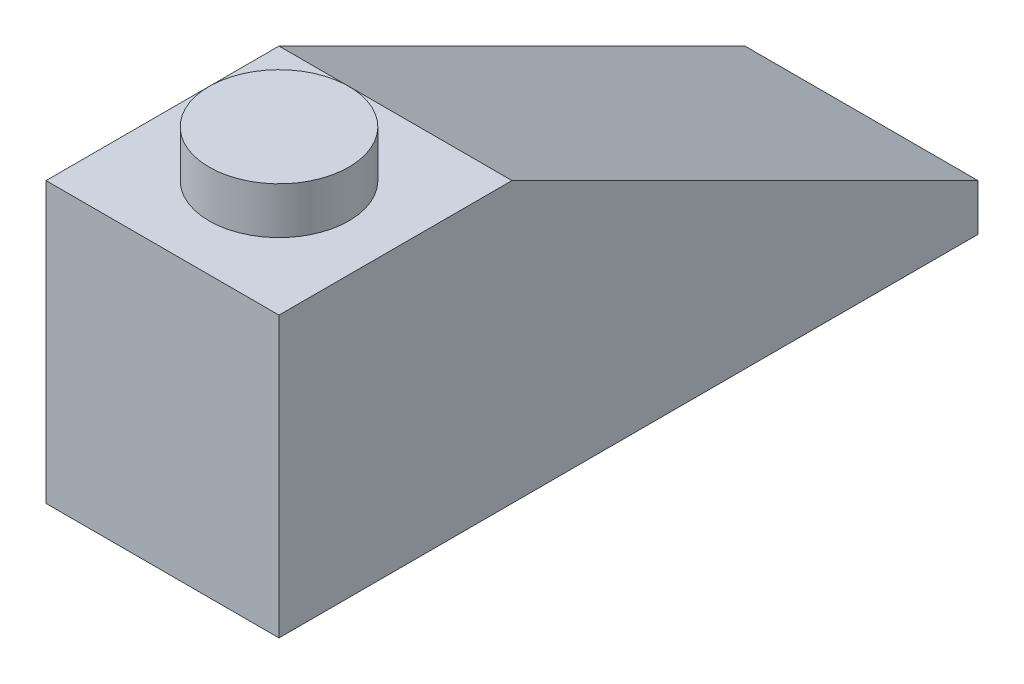
ISO-10303-21;
HEADER;
FILE_DESCRIPTION(('STEP AP214'),'2;1');
FILE_NAME('part.step','',(''),(''),'','','');
FILE_SCHEMA(('AUTOMOTIVE_DESIGN { 1 0 10303 214 1 1 1 1 }'));
ENDSEC;
DATA;
#1=APPLICATION_CONTEXT('core data for automotive mechanical design processes');
#2=APPLICATION_PROTOCOL_DEFINITION('international standard','automotive_design',2000,#1);
#3=PRODUCT_CONTEXT('',#1,'mechanical');
#4=PRODUCT('Part','Part','',(#3));
#5=PRODUCT_RELATED_PRODUCT_CATEGORY('part','',(#4));
#6=PRODUCT_DEFINITION_FORMATION('','',#4);
#7=PRODUCT_DEFINITION_CONTEXT('part definition',#1,'design');
#8=PRODUCT_DEFINITION('design','',#6,#7);
#9=PRODUCT_DEFINITION_SHAPE('','',#8);
#10=(LENGTH_UNIT() NAMED_UNIT(*) SI_UNIT(.MILLI.,.METRE.));
#11=(NAMED_UNIT(*) PLANE_ANGLE_UNIT() SI_UNIT($,.RADIAN.));
#12=(NAMED_UNIT(*) SI_UNIT($,.STERADIAN.) SOLID_ANGLE_UNIT());
#13=UNCERTAINTY_MEASURE_WITH_UNIT(LENGTH_MEASURE(1.E-05),#10,'distance_accuracy_value','');
#14=(GEOMETRIC_REPRESENTATION_CONTEXT(3) GLOBAL_UNCERTAINTY_ASSIGNED_CONTEXT((#13)) GLOBAL_UNIT_ASSIGNED_CONTEXT((#10,
#11,#12)) REPRESENTATION_CONTEXT('',''));
#15=CARTESIAN_POINT('',(0.,0.,0.));
#16=DIRECTION('',(0.,0.,1.));
#17=DIRECTION('',(1.,0.,0.));
#18=AXIS2_PLACEMENT_3D('',#15,#16,#17);
#19=CARTESIAN_POINT('',(8.,0.,0.));
#20=DIRECTION('',(0.,1.,0.));
#21=DIRECTION('',(0.,0.,1.));
#22=AXIS2_PLACEMENT_3D('',#19,#20,#21);
#23=PLANE('',#22);
#24=DIRECTION('',(0.,0.,-1.));
#25=VECTOR('',#24,1.);
#26=CARTESIAN_POINT('',(0.,0.,0.));
#27=LINE('',#26,#25);
#28=CARTESIAN_POINT('',(0.,0.,0.));
#29=VERTEX_POINT('',#28);
#30=CARTESIAN_POINT('',(0.,0.,-24.));
#31=VERTEX_POINT('',#30);
#32=EDGE_CURVE('E138',#29,#31,#27,.T.);
#33=ORIENTED_EDGE('',*,*,#32,.T.);
#34=DIRECTION('',(-1.,0.,0.));
#35=VECTOR('',#34,1.);
#36=CARTESIAN_POINT('',(8.,0.,-24.));
#37=LINE('',#36,#35);
#38=CARTESIAN_POINT('',(8.,0.,-24.));
#39=VERTEX_POINT('',#38);
#40=EDGE_CURVE('E123',#39,#31,#37,.T.);
#41=ORIENTED_EDGE('',*,*,#40,.F.);
#42=DIRECTION('',(0.,0.,-1.));
#43=VECTOR('',#42,1.);
#44=CARTESIAN_POINT('',(8.,0.,0.));
#45=LINE('',#44,#43);
#46=CARTESIAN_POINT('',(8.,0.,0.));
#47=VERTEX_POINT('',#46);
#48=EDGE_CURVE('E98',#47,#39,#45,.T.);
#49=ORIENTED_EDGE('',*,*,#48,.F.);
#50=DIRECTION('',(-1.,0.,0.));
#51=VECTOR('',#50,1.);
#52=CARTESIAN_POINT('',(8.,0.,0.));
#53=LINE('',#52,#51);
#54=EDGE_CURVE('E43',#47,#29,#53,.T.);
#55=ORIENTED_EDGE('',*,*,#54,.T.);
#56=EDGE_LOOP('',(#33,#41,#49,#55));
#57=FACE_BOUND('',#56,.T.);
#58=DIRECTION('',(0.,0.,-1.));
#59=VECTOR('',#58,1.);
#60=CARTESIAN_POINT('',(1.6,0.,0.));
#61=LINE('',#60,#59);
#62=CARTESIAN_POINT('',(1.6,0.,-1.6));
#63=VERTEX_POINT('',#62);
#64=CARTESIAN_POINT('',(1.6,0.,-22.4));
#65=VERTEX_POINT('',#64);
#66=EDGE_CURVE('E182',#63,#65,#61,.T.);
#67=ORIENTED_EDGE('',*,*,#66,.F.);
#68=DIRECTION('',(-1.,0.,0.));
#69=VECTOR('',#68,1.);
#70=CARTESIAN_POINT('',(8.,0.,-1.6));
#71=LINE('',#70,#69);
#72=CARTESIAN_POINT('',(6.4,0.,-1.6));
#73=VERTEX_POINT('',#72);
#74=EDGE_CURVE('E180',#73,#63,#71,.T.);
#75=ORIENTED_EDGE('',*,*,#74,.F.);
#76=DIRECTION('',(0.,0.,-1.));
#77=VECTOR('',#76,1.);
#78=CARTESIAN_POINT('',(6.4,0.,0.));
#79=LINE('',#78,#77);
#80=CARTESIAN_POINT('',(6.4,0.,-22.4));
#81=VERTEX_POINT('',#80);
#82=EDGE_CURVE('E171',#73,#81,#79,.T.);
#83=ORIENTED_EDGE('',*,*,#82,.T.);
#84=DIRECTION('',(-1.,0.,0.));
#85=VECTOR('',#84,1.);
#86=CARTESIAN_POINT('',(8.,0.,-22.4));
#87=LINE('',#86,#85);
#88=EDGE_CURVE('E176',#81,#65,#87,.T.);
#89=ORIENTED_EDGE('',*,*,#88,.T.);
#90=EDGE_LOOP('',(#67,#75,#83,#89));
#91=FACE_BOUND('',#90,.T.);
#92=ADVANCED_FACE('F39',(#57,#91),#23,.F.);
#93=CARTESIAN_POINT('',(8.,9.6,0.));
#94=DIRECTION('',(0.,0.,-1.));
#95=DIRECTION('',(-1.,0.,0.));
#96=AXIS2_PLACEMENT_3D('',#93,#94,#95);
#97=PLANE('',#96);
#98=DIRECTION('',(0.,-1.,0.));
#99=VECTOR('',#98,1.);
#100=CARTESIAN_POINT('',(0.,9.6,0.));
#101=LINE('',#100,#99);
#102=CARTESIAN_POINT('',(0.,9.6,0.));
#103=VERTEX_POINT('',#102);
#104=EDGE_CURVE('E134',#103,#29,#101,.T.);
#105=ORIENTED_EDGE('',*,*,#104,.T.);
#106=ORIENTED_EDGE('',*,*,#54,.F.);
#107=DIRECTION('',(0.,-1.,0.));
#108=VECTOR('',#107,1.);
#109=CARTESIAN_POINT('',(8.,9.6,0.));
#110=LINE('',#109,#108);
#111=CARTESIAN_POINT('',(8.,9.6,0.));
#112=VERTEX_POINT('',#111);
#113=EDGE_CURVE('E149',#112,#47,#110,.T.);
#114=ORIENTED_EDGE('',*,*,#113,.F.);
#115=DIRECTION('',(-1.,0.,0.));
#116=VECTOR('',#115,1.);
#117=CARTESIAN_POINT('',(8.,9.6,0.));
#118=LINE('',#117,#116);
#119=EDGE_CURVE('E130',#112,#103,#118,.T.);
#120=ORIENTED_EDGE('',*,*,#119,.T.);
#121=EDGE_LOOP('',(#105,#106,#114,#120));
#122=FACE_BOUND('',#121,.T.);
#123=ADVANCED_FACE('F41',(#122),#97,.F.);
#124=CARTESIAN_POINT('',(8.,0.,-24.));
#125=DIRECTION('',(0.,0.,1.));
#126=DIRECTION('',(1.,0.,0.));
#127=AXIS2_PLACEMENT_3D('',#124,#125,#126);
#128=PLANE('',#127);
#129=DIRECTION('',(0.,1.,0.));
#130=VECTOR('',#129,1.);
#131=CARTESIAN_POINT('',(0.,0.,-24.));
#132=LINE('',#131,#130);
#133=CARTESIAN_POINT('',(0.,1.6,-24.));
#134=VERTEX_POINT('',#133);
#135=EDGE_CURVE('E119',#31,#134,#132,.T.);
#136=ORIENTED_EDGE('',*,*,#135,.T.);
#137=DIRECTION('',(-1.,0.,0.));
#138=VECTOR('',#137,1.);
#139=CARTESIAN_POINT('',(8.,1.6,-24.));
#140=LINE('',#139,#138);
#141=CARTESIAN_POINT('',(8.,1.6,-24.));
#142=VERTEX_POINT('',#141);
#143=EDGE_CURVE('E116',#142,#134,#140,.T.);
#144=ORIENTED_EDGE('',*,*,#143,.F.);
#145=DIRECTION('',(0.,1.,0.));
#146=VECTOR('',#145,1.);
#147=CARTESIAN_POINT('',(8.,0.,-24.));
#148=LINE('',#147,#146);
#149=EDGE_CURVE('E105',#39,#142,#148,.T.);
#150=ORIENTED_EDGE('',*,*,#149,.F.);
#151=ORIENTED_EDGE('',*,*,#40,.T.);
#152=EDGE_LOOP('',(#136,#144,#150,#151));
#153=FACE_BOUND('',#152,.T.);
#154=ADVANCED_FACE('F117',(#153),#128,.F.);
#155=CARTESIAN_POINT('',(8.,1.6,-24.));
#156=DIRECTION('',(0.,-0.894427190999916,0.447213595499958));
#157=DIRECTION('',(0.,-0.447213595499958,-0.894427190999916));
#158=AXIS2_PLACEMENT_3D('',#155,#156,#157);
#159=PLANE('',#158);
#160=DIRECTION('',(0.,0.447213595499958,0.894427190999916));
#161=VECTOR('',#160,1.);
#162=CARTESIAN_POINT('',(0.,1.6,-24.));
#163=LINE('',#162,#161);
#164=CARTESIAN_POINT('',(0.,9.6,-8.));
#165=VERTEX_POINT('',#164);
#166=EDGE_CURVE('E144',#134,#165,#163,.T.);
#167=ORIENTED_EDGE('',*,*,#166,.T.);
#168=DIRECTION('',(-1.,0.,0.));
#169=VECTOR('',#168,1.);
#170=CARTESIAN_POINT('',(8.,9.6,-8.));
#171=LINE('',#170,#169);
#172=CARTESIAN_POINT('',(8.,9.6,-8.));
#173=VERTEX_POINT('',#172);
#174=EDGE_CURVE('E124',#173,#165,#171,.T.);
#175=ORIENTED_EDGE('',*,*,#174,.F.);
#176=DIRECTION('',(0.,0.447213595499958,0.894427190999916));
#177=VECTOR('',#176,1.);
#178=CARTESIAN_POINT('',(8.,1.6,-24.));
#179=LINE('',#178,#177);
#180=EDGE_CURVE('E109',#142,#173,#179,.T.);
#181=ORIENTED_EDGE('',*,*,#180,.F.);
#182=ORIENTED_EDGE('',*,*,#143,.T.);
#183=EDGE_LOOP('',(#167,#175,#181,#182));
#184=FACE_BOUND('',#183,.T.);
#185=ADVANCED_FACE('F126',(#184),#159,.F.);
#186=CARTESIAN_POINT('',(8.,9.6,-8.));
#187=DIRECTION('',(0.,-1.,0.));
#188=DIRECTION('',(0.,0.,-1.));
#189=AXIS2_PLACEMENT_3D('',#186,#187,#188);
#190=PLANE('',#189);
#191=CARTESIAN_POINT('',(4.,9.6,-4.));
#192=DIRECTION('',(0.,1.,0.));
#193=DIRECTION('',(0.,0.,1.));
#194=AXIS2_PLACEMENT_3D('',#191,#192,#193);
#195=CIRCLE('',#194,2.4);
#196=CARTESIAN_POINT('',(4.,9.6,-1.6));
#197=VERTEX_POINT('',#196);
#198=EDGE_CURVE('E11',#197,#197,#195,.T.);
#199=ORIENTED_EDGE('',*,*,#198,.F.);
#200=EDGE_LOOP('',(#199));
#201=FACE_BOUND('',#200,.T.);
#202=DIRECTION('',(0.,0.,1.));
#203=VECTOR('',#202,1.);
#204=CARTESIAN_POINT('',(0.,9.6,-8.));
#205=LINE('',#204,#203);
#206=EDGE_CURVE('E89',#165,#103,#205,.T.);
#207=ORIENTED_EDGE('',*,*,#206,.T.);
#208=ORIENTED_EDGE('',*,*,#119,.F.);
#209=DIRECTION('',(0.,0.,1.));
#210=VECTOR('',#209,1.);
#211=CARTESIAN_POINT('',(8.,9.6,-8.));
#212=LINE('',#211,#210);
#213=EDGE_CURVE('E65',#173,#112,#212,.T.);
#214=ORIENTED_EDGE('',*,*,#213,.F.);
#215=ORIENTED_EDGE('',*,*,#174,.T.);
#216=EDGE_LOOP('',(#207,#208,#214,#215));
#217=FACE_BOUND('',#216,.T.);
#218=ADVANCED_FACE('F162',(#201,#217),#190,.F.);
#219=CARTESIAN_POINT('',(8.,0.,0.));
#220=DIRECTION('',(1.,0.,0.));
#221=DIRECTION('',(0.,0.,-1.));
#222=AXIS2_PLACEMENT_3D('',#219,#220,#221);
#223=PLANE('',#222);
#224=ORIENTED_EDGE('',*,*,#113,.T.);
#225=ORIENTED_EDGE('',*,*,#48,.T.);
#226=ORIENTED_EDGE('',*,*,#149,.T.);
#227=ORIENTED_EDGE('',*,*,#180,.T.);
#228=ORIENTED_EDGE('',*,*,#213,.T.);
#229=EDGE_LOOP('',(#224,#225,#226,#227,#228));
#230=FACE_BOUND('',#229,.T.);
#231=ADVANCED_FACE('F107',(#230),#223,.T.);
#232=CARTESIAN_POINT('',(0.,0.,0.));
#233=DIRECTION('',(1.,0.,0.));
#234=DIRECTION('',(0.,0.,-1.));
#235=AXIS2_PLACEMENT_3D('',#232,#233,#234);
#236=PLANE('',#235);
#237=ORIENTED_EDGE('',*,*,#104,.F.);
#238=ORIENTED_EDGE('',*,*,#206,.F.);
#239=ORIENTED_EDGE('',*,*,#166,.F.);
#240=ORIENTED_EDGE('',*,*,#135,.F.);
#241=ORIENTED_EDGE('',*,*,#32,.F.);
#242=EDGE_LOOP('',(#237,#238,#239,#240,#241));
#243=FACE_BOUND('',#242,.T.);
#244=ADVANCED_FACE('F161',(#243),#236,.F.);
#245=CARTESIAN_POINT('',(4.,11.2,-4.));
#246=DIRECTION('',(0.,-1.,0.));
#247=DIRECTION('',(0.,0.,-1.));
#248=AXIS2_PLACEMENT_3D('',#245,#246,#247);
#249=CYLINDRICAL_SURFACE('',#248,2.4);
#250=CARTESIAN_POINT('',(4.,11.2,-4.));
#251=DIRECTION('',(0.,1.,0.));
#252=DIRECTION('',(0.,0.,1.));
#253=AXIS2_PLACEMENT_3D('',#250,#251,#252);
#254=CIRCLE('',#253,2.4);
#255=CARTESIAN_POINT('',(4.,11.2,-1.6));
#256=VERTEX_POINT('',#255);
#257=EDGE_CURVE('E139',#256,#256,#254,.T.);
#258=ORIENTED_EDGE('',*,*,#257,.F.);
#259=EDGE_LOOP('',(#258));
#260=FACE_BOUND('',#259,.T.);
#261=ORIENTED_EDGE('',*,*,#198,.T.);
#262=EDGE_LOOP('',(#261));
#263=FACE_BOUND('',#262,.T.);
#264=ADVANCED_FACE('F279',(#260,#263),#249,.T.);
#265=CARTESIAN_POINT('',(4.,11.2,-4.));
#266=DIRECTION('',(0.,1.,0.));
#267=DIRECTION('',(0.,0.,1.));
#268=AXIS2_PLACEMENT_3D('',#265,#266,#267);
#269=PLANE('',#268);
#270=ORIENTED_EDGE('',*,*,#257,.T.);
#271=EDGE_LOOP('',(#270));
#272=FACE_BOUND('',#271,.T.);
#273=ADVANCED_FACE('F272',(#272),#269,.T.);
#274=CARTESIAN_POINT('',(8.,9.6,-1.6));
#275=DIRECTION('',(0.,0.,-1.));
#276=DIRECTION('',(-1.,0.,0.));
#277=AXIS2_PLACEMENT_3D('',#274,#275,#276);
#278=PLANE('',#277);
#279=DIRECTION('',(0.,-1.,0.));
#280=VECTOR('',#279,1.);
#281=CARTESIAN_POINT('',(1.6,9.6,-1.6));
#282=LINE('',#281,#280);
#283=CARTESIAN_POINT('',(1.6,8.,-1.6));
#284=VERTEX_POINT('',#283);
#285=EDGE_CURVE('E187',#284,#63,#282,.T.);
#286=ORIENTED_EDGE('',*,*,#285,.F.);
#287=DIRECTION('',(-1.,0.,0.));
#288=VECTOR('',#287,1.);
#289=CARTESIAN_POINT('',(8.,8.,-1.6));
#290=LINE('',#289,#288);
#291=CARTESIAN_POINT('',(6.4,8.,-1.6));
#292=VERTEX_POINT('',#291);
#293=EDGE_CURVE('E217',#292,#284,#290,.T.);
#294=ORIENTED_EDGE('',*,*,#293,.F.);
#295=DIRECTION('',(0.,-1.,0.));
#296=VECTOR('',#295,1.);
#297=CARTESIAN_POINT('',(6.4,9.6,-1.6));
#298=LINE('',#297,#296);
#299=EDGE_CURVE('E56',#292,#73,#298,.T.);
#300=ORIENTED_EDGE('',*,*,#299,.T.);
#301=ORIENTED_EDGE('',*,*,#74,.T.);
#302=EDGE_LOOP('',(#286,#294,#300,#301));
#303=FACE_BOUND('',#302,.T.);
#304=ADVANCED_FACE('F270',(#303),#278,.T.);
#305=CARTESIAN_POINT('',(8.,0.,-22.4));
#306=DIRECTION('',(0.,0.,1.));
#307=DIRECTION('',(1.,0.,0.));
#308=AXIS2_PLACEMENT_3D('',#305,#306,#307);
#309=PLANE('',#308);
#310=DIRECTION('',(0.,1.,0.));
#311=VECTOR('',#310,1.);
#312=CARTESIAN_POINT('',(1.6,0.,-22.4));
#313=LINE('',#312,#311);
#314=CARTESIAN_POINT('',(1.6,0.611145618000168,-22.4));
#315=VERTEX_POINT('',#314);
#316=EDGE_CURVE('E186',#65,#315,#313,.T.);
#317=ORIENTED_EDGE('',*,*,#316,.F.);
#318=ORIENTED_EDGE('',*,*,#88,.F.);
#319=DIRECTION('',(0.,1.,0.));
#320=VECTOR('',#319,1.);
#321=CARTESIAN_POINT('',(6.4,0.,-22.4));
#322=LINE('',#321,#320);
#323=CARTESIAN_POINT('',(6.4,0.611145618000168,-22.4));
#324=VERTEX_POINT('',#323);
#325=EDGE_CURVE('E175',#81,#324,#322,.T.);
#326=ORIENTED_EDGE('',*,*,#325,.T.);
#327=DIRECTION('',(-1.,0.,0.));
#328=VECTOR('',#327,1.);
#329=CARTESIAN_POINT('',(8.,0.611145618000168,-22.4));
#330=LINE('',#329,#328);
#331=EDGE_CURVE('E181',#324,#315,#330,.T.);
#332=ORIENTED_EDGE('',*,*,#331,.T.);
#333=EDGE_LOOP('',(#317,#318,#326,#332));
#334=FACE_BOUND('',#333,.T.);
#335=ADVANCED_FACE('F249',(#334),#309,.T.);
#336=CARTESIAN_POINT('',(8.,0.168916494400135,-23.2844582472001));
#337=DIRECTION('',(0.,-0.894427190999916,0.447213595499958));
#338=DIRECTION('',(0.,-0.447213595499958,-0.894427190999916));
#339=AXIS2_PLACEMENT_3D('',#336,#337,#338);
#340=PLANE('',#339);
#341=DIRECTION('',(0.,0.447213595499958,0.894427190999916));
#342=VECTOR('',#341,1.);
#343=CARTESIAN_POINT('',(1.6,0.168916494400135,-23.2844582472001));
#344=LINE('',#343,#342);
#345=CARTESIAN_POINT('',(1.6,8.,-7.62229123600034));
#346=VERTEX_POINT('',#345);
#347=EDGE_CURVE('E201',#315,#346,#344,.T.);
#348=ORIENTED_EDGE('',*,*,#347,.F.);
#349=ORIENTED_EDGE('',*,*,#331,.F.);
#350=DIRECTION('',(0.,0.447213595499958,0.894427190999916));
#351=VECTOR('',#350,1.);
#352=CARTESIAN_POINT('',(6.4,0.168916494400135,-23.2844582472001));
#353=LINE('',#352,#351);
#354=CARTESIAN_POINT('',(6.4,8.,-7.62229123600034));
#355=VERTEX_POINT('',#354);
#356=EDGE_CURVE('E197',#324,#355,#353,.T.);
#357=ORIENTED_EDGE('',*,*,#356,.T.);
#358=DIRECTION('',(-1.,0.,0.));
#359=VECTOR('',#358,1.);
#360=CARTESIAN_POINT('',(8.,8.,-7.62229123600034));
#361=LINE('',#360,#359);
#362=EDGE_CURVE('E205',#355,#346,#361,.T.);
#363=ORIENTED_EDGE('',*,*,#362,.T.);
#364=EDGE_LOOP('',(#348,#349,#357,#363));
#365=FACE_BOUND('',#364,.T.);
#366=ADVANCED_FACE('F261',(#365),#340,.T.);
#367=CARTESIAN_POINT('',(8.,8.,-8.));
#368=DIRECTION('',(0.,-1.,0.));
#369=DIRECTION('',(0.,0.,-1.));
#370=AXIS2_PLACEMENT_3D('',#367,#368,#369);
#371=PLANE('',#370);
#372=CARTESIAN_POINT('',(4.,8.,-4.));
#373=DIRECTION('',(0.,-1.,0.));
#374=DIRECTION('',(0.,0.,-1.));
#375=AXIS2_PLACEMENT_3D('',#372,#373,#374);
#376=CIRCLE('',#375,0.8);
#377=CARTESIAN_POINT('',(4.,8.,-4.8));
#378=VERTEX_POINT('',#377);
#379=EDGE_CURVE('E170',#378,#378,#376,.F.);
#380=ORIENTED_EDGE('',*,*,#379,.T.);
#381=EDGE_LOOP('',(#380));
#382=FACE_BOUND('',#381,.T.);
#383=DIRECTION('',(0.,0.,1.));
#384=VECTOR('',#383,1.);
#385=CARTESIAN_POINT('',(1.6,8.,-8.));
#386=LINE('',#385,#384);
#387=EDGE_CURVE('E213',#346,#284,#386,.T.);
#388=ORIENTED_EDGE('',*,*,#387,.F.);
#389=ORIENTED_EDGE('',*,*,#362,.F.);
#390=DIRECTION('',(0.,0.,1.));
#391=VECTOR('',#390,1.);
#392=CARTESIAN_POINT('',(6.4,8.,-8.));
#393=LINE('',#392,#391);
#394=EDGE_CURVE('E209',#355,#292,#393,.T.);
#395=ORIENTED_EDGE('',*,*,#394,.T.);
#396=ORIENTED_EDGE('',*,*,#293,.T.);
#397=EDGE_LOOP('',(#388,#389,#395,#396));
#398=FACE_BOUND('',#397,.T.);
#399=ADVANCED_FACE('F265',(#382,#398),#371,.T.);
#400=CARTESIAN_POINT('',(6.4,0.,0.));
#401=DIRECTION('',(1.,0.,0.));
#402=DIRECTION('',(0.,0.,-1.));
#403=AXIS2_PLACEMENT_3D('',#400,#401,#402);
#404=PLANE('',#403);
#405=ORIENTED_EDGE('',*,*,#299,.F.);
#406=ORIENTED_EDGE('',*,*,#394,.F.);
#407=ORIENTED_EDGE('',*,*,#356,.F.);
#408=ORIENTED_EDGE('',*,*,#325,.F.);
#409=ORIENTED_EDGE('',*,*,#82,.F.);
#410=EDGE_LOOP('',(#405,#406,#407,#408,#409));
#411=FACE_BOUND('',#410,.T.);
#412=ADVANCED_FACE('F254',(#411),#404,.F.);
#413=CARTESIAN_POINT('',(1.6,0.,0.));
#414=DIRECTION('',(1.,0.,0.));
#415=DIRECTION('',(0.,0.,-1.));
#416=AXIS2_PLACEMENT_3D('',#413,#414,#415);
#417=PLANE('',#416);
#418=ORIENTED_EDGE('',*,*,#285,.T.);
#419=ORIENTED_EDGE('',*,*,#66,.T.);
#420=ORIENTED_EDGE('',*,*,#316,.T.);
#421=ORIENTED_EDGE('',*,*,#347,.T.);
#422=ORIENTED_EDGE('',*,*,#387,.T.);
#423=EDGE_LOOP('',(#418,#419,#420,#421,#422));
#424=FACE_BOUND('',#423,.T.);
#425=ADVANCED_FACE('F238',(#424),#417,.T.);
#426=CARTESIAN_POINT('',(4.,11.2,-4.));
#427=DIRECTION('',(0.,-1.,0.));
#428=DIRECTION('',(0.,0.,-1.));
#429=AXIS2_PLACEMENT_3D('',#426,#427,#428);
#430=CYLINDRICAL_SURFACE('',#429,0.8);
#431=CARTESIAN_POINT('',(4.,9.6,-4.));
#432=DIRECTION('',(0.,1.,0.));
#433=DIRECTION('',(0.,0.,1.));
#434=AXIS2_PLACEMENT_3D('',#431,#432,#433);
#435=CIRCLE('',#434,0.8);
#436=CARTESIAN_POINT('',(4.,9.6,-3.2));
#437=VERTEX_POINT('',#436);
#438=EDGE_CURVE('E190',#437,#437,#435,.T.);
#439=ORIENTED_EDGE('',*,*,#438,.T.);
#440=EDGE_LOOP('',(#439));
#441=FACE_BOUND('',#440,.T.);
#442=ORIENTED_EDGE('',*,*,#379,.F.);
#443=EDGE_LOOP('',(#442));
#444=FACE_BOUND('',#443,.T.);
#445=ADVANCED_FACE('F304',(#441,#444),#430,.F.);
#446=CARTESIAN_POINT('',(4.,9.6,-4.));
#447=DIRECTION('',(0.,1.,0.));
#448=DIRECTION('',(0.,0.,1.));
#449=AXIS2_PLACEMENT_3D('',#446,#447,#448);
#450=PLANE('',#449);
#451=ORIENTED_EDGE('',*,*,#438,.F.);
#452=EDGE_LOOP('',(#451));
#453=FACE_BOUND('',#452,.T.);
#454=ADVANCED_FACE('F301',(#453),#450,.F.);
#455=CLOSED_SHELL('',(#92,#123,#154,#185,#218,#231,#244,#264,#273,#304,#335,#366,#399,#412,#425,
#445,#454));
#456=MANIFOLD_SOLID_BREP('B2',#455);
#457=ADVANCED_BREP_SHAPE_REPRESENTATION('',(#18,#456),#14);
#458=SHAPE_DEFINITION_REPRESENTATION(#9,#457);
ENDSEC;
END-ISO-10303-21;
